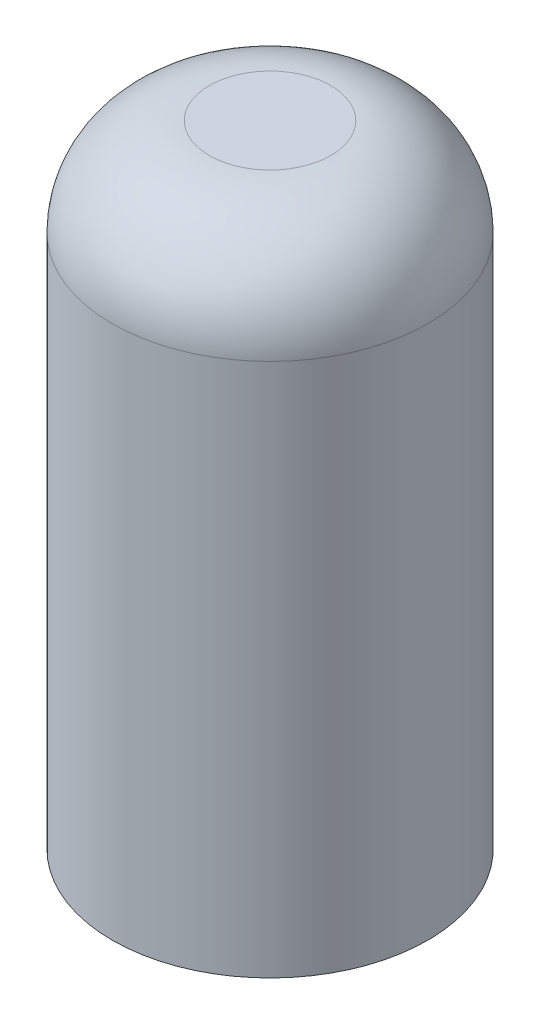
ISO-10303-21;
HEADER;
FILE_DESCRIPTION(('STEP AP214'),'2;1');
FILE_NAME('part.step','',(''),(''),'','','');
FILE_SCHEMA(('AUTOMOTIVE_DESIGN { 1 0 10303 214 1 1 1 1 }'));
ENDSEC;
DATA;
#1=APPLICATION_CONTEXT('core data for automotive mechanical design processes');
#2=APPLICATION_PROTOCOL_DEFINITION('international standard','automotive_design',2000,#1);
#3=PRODUCT_CONTEXT('',#1,'mechanical');
#4=PRODUCT('Part','Part','',(#3));
#5=PRODUCT_RELATED_PRODUCT_CATEGORY('part','',(#4));
#6=PRODUCT_DEFINITION_FORMATION('','',#4);
#7=PRODUCT_DEFINITION_CONTEXT('part definition',#1,'design');
#8=PRODUCT_DEFINITION('design','',#6,#7);
#9=PRODUCT_DEFINITION_SHAPE('','',#8);
#10=(LENGTH_UNIT() NAMED_UNIT(*) SI_UNIT(.MILLI.,.METRE.));
#11=(NAMED_UNIT(*) PLANE_ANGLE_UNIT() SI_UNIT($,.RADIAN.));
#12=(NAMED_UNIT(*) SI_UNIT($,.STERADIAN.) SOLID_ANGLE_UNIT());
#13=UNCERTAINTY_MEASURE_WITH_UNIT(LENGTH_MEASURE(1.E-05),#10,'distance_accuracy_value','');
#14=(GEOMETRIC_REPRESENTATION_CONTEXT(3) GLOBAL_UNCERTAINTY_ASSIGNED_CONTEXT((#13)) GLOBAL_UNIT_ASSIGNED_CONTEXT((#10,
#11,#12)) REPRESENTATION_CONTEXT('',''));
#15=CARTESIAN_POINT('',(0.,0.,0.));
#16=DIRECTION('',(0.,0.,1.));
#17=DIRECTION('',(1.,0.,0.));
#18=AXIS2_PLACEMENT_3D('',#15,#16,#17);
#19=CARTESIAN_POINT('',(0.,13.,0.));
#20=DIRECTION('',(0.,-1.,0.));
#21=DIRECTION('',(0.,0.,-1.));
#22=AXIS2_PLACEMENT_3D('',#19,#20,#21);
#23=CYLINDRICAL_SURFACE('',#22,3.25);
#24=CARTESIAN_POINT('',(0.,11.,0.));
#25=DIRECTION('',(0.,1.,0.));
#26=DIRECTION('',(0.,0.,1.));
#27=AXIS2_PLACEMENT_3D('',#24,#25,#26);
#28=CIRCLE('',#27,3.25);
#29=CARTESIAN_POINT('',(0.,11.,3.25));
#30=VERTEX_POINT('',#29);
#31=EDGE_CURVE('E10',#30,#30,#28,.F.);
#32=ORIENTED_EDGE('',*,*,#31,.T.);
#33=EDGE_LOOP('',(#32));
#34=FACE_BOUND('',#33,.T.);
#35=CARTESIAN_POINT('',(0.,0.,0.));
#36=DIRECTION('',(0.,1.,0.));
#37=DIRECTION('',(0.,0.,1.));
#38=AXIS2_PLACEMENT_3D('',#35,#36,#37);
#39=CIRCLE('',#38,3.25);
#40=CARTESIAN_POINT('',(0.,0.,3.25));
#41=VERTEX_POINT('',#40);
#42=EDGE_CURVE('E43',#41,#41,#39,.T.);
#43=ORIENTED_EDGE('',*,*,#42,.T.);
#44=EDGE_LOOP('',(#43));
#45=FACE_BOUND('',#44,.T.);
#46=ADVANCED_FACE('F32',(#34,#45),#23,.T.);
#47=CARTESIAN_POINT('',(0.,13.,0.));
#48=DIRECTION('',(0.,1.,0.));
#49=DIRECTION('',(0.,0.,1.));
#50=AXIS2_PLACEMENT_3D('',#47,#48,#49);
#51=PLANE('',#50);
#52=CARTESIAN_POINT('',(0.,13.,0.));
#53=DIRECTION('',(0.,1.,0.));
#54=DIRECTION('',(0.,0.,1.));
#55=AXIS2_PLACEMENT_3D('',#52,#53,#54);
#56=CIRCLE('',#55,1.25);
#57=CARTESIAN_POINT('',(0.,13.,1.25));
#58=VERTEX_POINT('',#57);
#59=EDGE_CURVE('E39',#58,#58,#56,.T.);
#60=ORIENTED_EDGE('',*,*,#59,.T.);
#61=EDGE_LOOP('',(#60));
#62=FACE_BOUND('',#61,.T.);
#63=ADVANCED_FACE('F53',(#62),#51,.T.);
#64=CARTESIAN_POINT('',(0.,0.,0.));
#65=DIRECTION('',(0.,1.,0.));
#66=DIRECTION('',(0.,0.,1.));
#67=AXIS2_PLACEMENT_3D('',#64,#65,#66);
#68=PLANE('',#67);
#69=ORIENTED_EDGE('',*,*,#42,.F.);
#70=EDGE_LOOP('',(#69));
#71=FACE_BOUND('',#70,.T.);
#72=ADVANCED_FACE('F51',(#71),#68,.F.);
#73=CARTESIAN_POINT('',(0.,11.,0.));
#74=DIRECTION('',(0.,1.,0.));
#75=DIRECTION('',(0.,0.,1.));
#76=AXIS2_PLACEMENT_3D('',#73,#74,#75);
#77=DEGENERATE_TOROIDAL_SURFACE('',#76,1.25,2.,.T.);
#78=ORIENTED_EDGE('',*,*,#31,.F.);
#79=EDGE_LOOP('',(#78));
#80=FACE_BOUND('',#79,.T.);
#81=ORIENTED_EDGE('',*,*,#59,.F.);
#82=EDGE_LOOP('',(#81));
#83=FACE_BOUND('',#82,.T.);
#84=ADVANCED_FACE('F34',(#80,#83),#77,.T.);
#85=CLOSED_SHELL('',(#46,#63,#72,#84));
#86=MANIFOLD_SOLID_BREP('B2',#85);
#87=ADVANCED_BREP_SHAPE_REPRESENTATION('',(#18,#86),#14);
#88=SHAPE_DEFINITION_REPRESENTATION(#9,#87);
ENDSEC;
END-ISO-10303-21;
